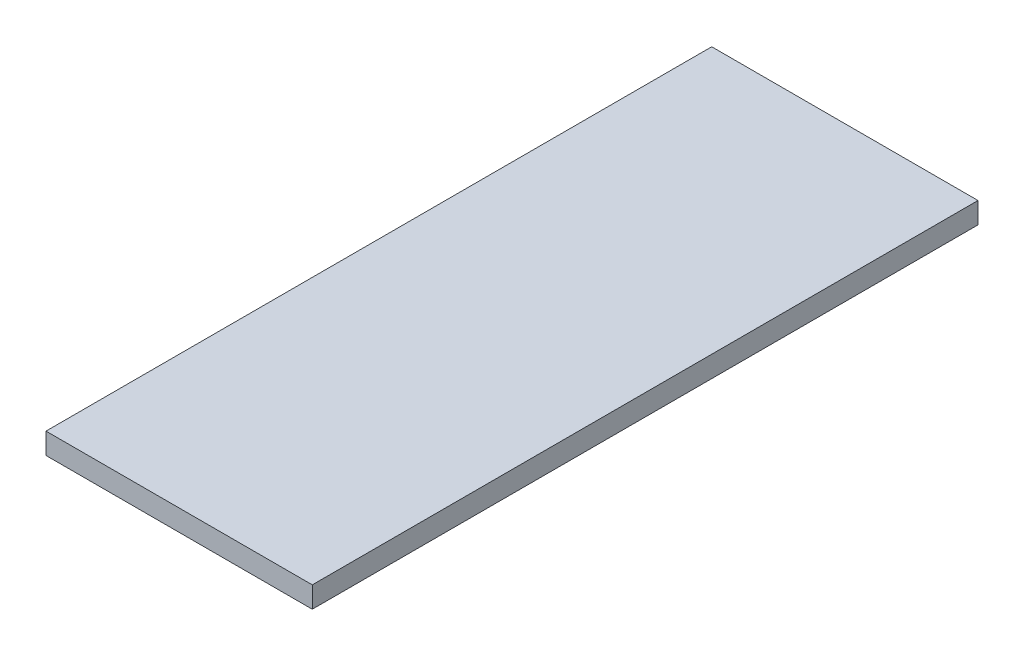
ISO-10303-21;
HEADER;
FILE_DESCRIPTION(('STEP AP214'),'2;1');
FILE_NAME('part.step','',(''),(''),'','','');
FILE_SCHEMA(('AUTOMOTIVE_DESIGN { 1 0 10303 214 1 1 1 1 }'));
ENDSEC;
DATA;
#1=APPLICATION_CONTEXT('core data for automotive mechanical design processes');
#2=APPLICATION_PROTOCOL_DEFINITION('international standard','automotive_design',2000,#1);
#3=PRODUCT_CONTEXT('',#1,'mechanical');
#4=PRODUCT('Part','Part','',(#3));
#5=PRODUCT_RELATED_PRODUCT_CATEGORY('part','',(#4));
#6=PRODUCT_DEFINITION_FORMATION('','',#4);
#7=PRODUCT_DEFINITION_CONTEXT('part definition',#1,'design');
#8=PRODUCT_DEFINITION('design','',#6,#7);
#9=PRODUCT_DEFINITION_SHAPE('','',#8);
#10=(LENGTH_UNIT() NAMED_UNIT(*) SI_UNIT(.MILLI.,.METRE.));
#11=(NAMED_UNIT(*) PLANE_ANGLE_UNIT() SI_UNIT($,.RADIAN.));
#12=(NAMED_UNIT(*) SI_UNIT($,.STERADIAN.) SOLID_ANGLE_UNIT());
#13=UNCERTAINTY_MEASURE_WITH_UNIT(LENGTH_MEASURE(1.E-05),#10,'distance_accuracy_value','');
#14=(GEOMETRIC_REPRESENTATION_CONTEXT(3) GLOBAL_UNCERTAINTY_ASSIGNED_CONTEXT((#13)) GLOBAL_UNIT_ASSIGNED_CONTEXT((#10,
#11,#12)) REPRESENTATION_CONTEXT('',''));
#15=CARTESIAN_POINT('',(0.,0.,0.));
#16=DIRECTION('',(0.,0.,1.));
#17=DIRECTION('',(1.,0.,0.));
#18=AXIS2_PLACEMENT_3D('',#15,#16,#17);
#19=CARTESIAN_POINT('',(160.,25.4,-400.));
#20=DIRECTION('',(-1.,0.,0.));
#21=DIRECTION('',(0.,0.,1.));
#22=AXIS2_PLACEMENT_3D('',#19,#20,#21);
#23=PLANE('',#22);
#24=DIRECTION('',(0.,0.,-1.));
#25=VECTOR('',#24,1.);
#26=CARTESIAN_POINT('',(160.,0.,-400.));
#27=LINE('',#26,#25);
#28=CARTESIAN_POINT('',(160.,0.,400.));
#29=VERTEX_POINT('',#28);
#30=CARTESIAN_POINT('',(160.,0.,-400.));
#31=VERTEX_POINT('',#30);
#32=EDGE_CURVE('E96',#29,#31,#27,.T.);
#33=ORIENTED_EDGE('',*,*,#32,.T.);
#34=DIRECTION('',(0.,-1.,0.));
#35=VECTOR('',#34,1.);
#36=CARTESIAN_POINT('',(160.,25.4,-400.));
#37=LINE('',#36,#35);
#38=CARTESIAN_POINT('',(160.,25.4,-400.));
#39=VERTEX_POINT('',#38);
#40=EDGE_CURVE('E11',#39,#31,#37,.T.);
#41=ORIENTED_EDGE('',*,*,#40,.F.);
#42=DIRECTION('',(0.,0.,-1.));
#43=VECTOR('',#42,1.);
#44=CARTESIAN_POINT('',(160.,25.4,-400.));
#45=LINE('',#44,#43);
#46=CARTESIAN_POINT('',(160.,25.4,400.));
#47=VERTEX_POINT('',#46);
#48=EDGE_CURVE('E84',#47,#39,#45,.T.);
#49=ORIENTED_EDGE('',*,*,#48,.F.);
#50=DIRECTION('',(0.,-1.,0.));
#51=VECTOR('',#50,1.);
#52=CARTESIAN_POINT('',(160.,25.4,400.));
#53=LINE('',#52,#51);
#54=EDGE_CURVE('E92',#47,#29,#53,.T.);
#55=ORIENTED_EDGE('',*,*,#54,.T.);
#56=EDGE_LOOP('',(#33,#41,#49,#55));
#57=FACE_BOUND('',#56,.T.);
#58=ADVANCED_FACE('F33',(#57),#23,.F.);
#59=CARTESIAN_POINT('',(-160.,25.4,-400.));
#60=DIRECTION('',(0.,0.,1.));
#61=DIRECTION('',(1.,0.,0.));
#62=AXIS2_PLACEMENT_3D('',#59,#60,#61);
#63=PLANE('',#62);
#64=DIRECTION('',(-1.,0.,0.));
#65=VECTOR('',#64,1.);
#66=CARTESIAN_POINT('',(-160.,0.,-400.));
#67=LINE('',#66,#65);
#68=CARTESIAN_POINT('',(-160.,0.,-400.));
#69=VERTEX_POINT('',#68);
#70=EDGE_CURVE('E88',#31,#69,#67,.T.);
#71=ORIENTED_EDGE('',*,*,#70,.T.);
#72=DIRECTION('',(0.,-1.,0.));
#73=VECTOR('',#72,1.);
#74=CARTESIAN_POINT('',(-160.,25.4,-400.));
#75=LINE('',#74,#73);
#76=CARTESIAN_POINT('',(-160.,25.4,-400.));
#77=VERTEX_POINT('',#76);
#78=EDGE_CURVE('E41',#77,#69,#75,.T.);
#79=ORIENTED_EDGE('',*,*,#78,.F.);
#80=DIRECTION('',(-1.,0.,0.));
#81=VECTOR('',#80,1.);
#82=CARTESIAN_POINT('',(-160.,25.4,-400.));
#83=LINE('',#82,#81);
#84=EDGE_CURVE('E79',#39,#77,#83,.T.);
#85=ORIENTED_EDGE('',*,*,#84,.F.);
#86=ORIENTED_EDGE('',*,*,#40,.T.);
#87=EDGE_LOOP('',(#71,#79,#85,#86));
#88=FACE_BOUND('',#87,.T.);
#89=ADVANCED_FACE('F87',(#88),#63,.F.);
#90=CARTESIAN_POINT('',(-160.,25.4,-400.));
#91=DIRECTION('',(1.,0.,0.));
#92=DIRECTION('',(0.,0.,-1.));
#93=AXIS2_PLACEMENT_3D('',#90,#91,#92);
#94=PLANE('',#93);
#95=DIRECTION('',(0.,0.,1.));
#96=VECTOR('',#95,1.);
#97=CARTESIAN_POINT('',(-160.,0.,-400.));
#98=LINE('',#97,#96);
#99=CARTESIAN_POINT('',(-160.,0.,400.));
#100=VERTEX_POINT('',#99);
#101=EDGE_CURVE('E66',#69,#100,#98,.T.);
#102=ORIENTED_EDGE('',*,*,#101,.T.);
#103=DIRECTION('',(0.,-1.,0.));
#104=VECTOR('',#103,1.);
#105=CARTESIAN_POINT('',(-160.,25.4,400.));
#106=LINE('',#105,#104);
#107=CARTESIAN_POINT('',(-160.,25.4,400.));
#108=VERTEX_POINT('',#107);
#109=EDGE_CURVE('E89',#108,#100,#106,.T.);
#110=ORIENTED_EDGE('',*,*,#109,.F.);
#111=DIRECTION('',(0.,0.,1.));
#112=VECTOR('',#111,1.);
#113=CARTESIAN_POINT('',(-160.,25.4,-400.));
#114=LINE('',#113,#112);
#115=EDGE_CURVE('E82',#77,#108,#114,.T.);
#116=ORIENTED_EDGE('',*,*,#115,.F.);
#117=ORIENTED_EDGE('',*,*,#78,.T.);
#118=EDGE_LOOP('',(#102,#110,#116,#117));
#119=FACE_BOUND('',#118,.T.);
#120=ADVANCED_FACE('F90',(#119),#94,.F.);
#121=CARTESIAN_POINT('',(-160.,25.4,400.));
#122=DIRECTION('',(0.,0.,-1.));
#123=DIRECTION('',(-1.,0.,0.));
#124=AXIS2_PLACEMENT_3D('',#121,#122,#123);
#125=PLANE('',#124);
#126=DIRECTION('',(1.,0.,0.));
#127=VECTOR('',#126,1.);
#128=CARTESIAN_POINT('',(-160.,0.,400.));
#129=LINE('',#128,#127);
#130=EDGE_CURVE('E72',#100,#29,#129,.T.);
#131=ORIENTED_EDGE('',*,*,#130,.T.);
#132=ORIENTED_EDGE('',*,*,#54,.F.);
#133=DIRECTION('',(1.,0.,0.));
#134=VECTOR('',#133,1.);
#135=CARTESIAN_POINT('',(-160.,25.4,400.));
#136=LINE('',#135,#134);
#137=EDGE_CURVE('E49',#108,#47,#136,.T.);
#138=ORIENTED_EDGE('',*,*,#137,.F.);
#139=ORIENTED_EDGE('',*,*,#109,.T.);
#140=EDGE_LOOP('',(#131,#132,#138,#139));
#141=FACE_BOUND('',#140,.T.);
#142=ADVANCED_FACE('F103',(#141),#125,.F.);
#143=CARTESIAN_POINT('',(0.,25.4,0.));
#144=DIRECTION('',(0.,1.,0.));
#145=DIRECTION('',(0.,0.,1.));
#146=AXIS2_PLACEMENT_3D('',#143,#144,#145);
#147=PLANE('',#146);
#148=ORIENTED_EDGE('',*,*,#48,.T.);
#149=ORIENTED_EDGE('',*,*,#84,.T.);
#150=ORIENTED_EDGE('',*,*,#115,.T.);
#151=ORIENTED_EDGE('',*,*,#137,.T.);
#152=EDGE_LOOP('',(#148,#149,#150,#151));
#153=FACE_BOUND('',#152,.T.);
#154=ADVANCED_FACE('F80',(#153),#147,.T.);
#155=CARTESIAN_POINT('',(0.,0.,0.));
#156=DIRECTION('',(0.,1.,0.));
#157=DIRECTION('',(0.,0.,1.));
#158=AXIS2_PLACEMENT_3D('',#155,#156,#157);
#159=PLANE('',#158);
#160=ORIENTED_EDGE('',*,*,#32,.F.);
#161=ORIENTED_EDGE('',*,*,#130,.F.);
#162=ORIENTED_EDGE('',*,*,#101,.F.);
#163=ORIENTED_EDGE('',*,*,#70,.F.);
#164=EDGE_LOOP('',(#160,#161,#162,#163));
#165=FACE_BOUND('',#164,.T.);
#166=ADVANCED_FACE('F106',(#165),#159,.F.);
#167=CLOSED_SHELL('',(#58,#89,#120,#142,#154,#166));
#168=MANIFOLD_SOLID_BREP('B2',#167);
#169=ADVANCED_BREP_SHAPE_REPRESENTATION('',(#18,#168),#14);
#170=SHAPE_DEFINITION_REPRESENTATION(#9,#169);
ENDSEC;
END-ISO-10303-21;
